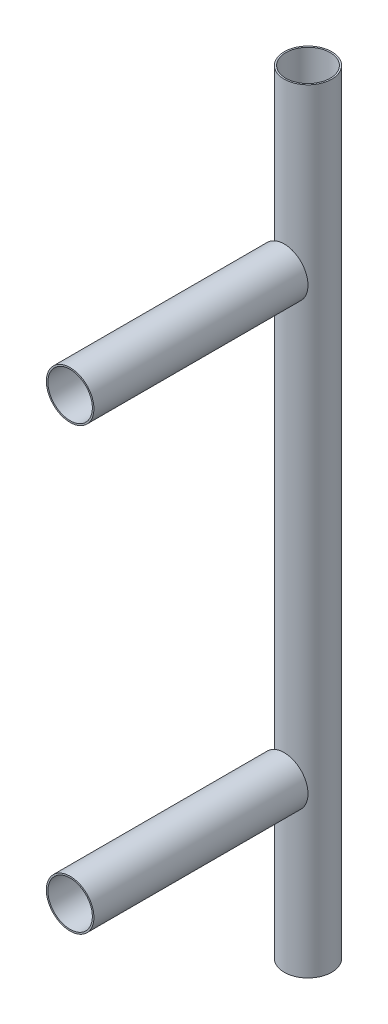
ISO-10303-21;
HEADER;
FILE_DESCRIPTION(('STEP AP214'),'2;1');
FILE_NAME('part.step','',(''),(''),'','','');
FILE_SCHEMA(('AUTOMOTIVE_DESIGN { 1 0 10303 214 1 1 1 1 }'));
ENDSEC;
DATA;
#1=APPLICATION_CONTEXT('core data for automotive mechanical design processes');
#2=APPLICATION_PROTOCOL_DEFINITION('international standard','automotive_design',2000,#1);
#3=PRODUCT_CONTEXT('',#1,'mechanical');
#4=PRODUCT('Part','Part','',(#3));
#5=PRODUCT_RELATED_PRODUCT_CATEGORY('part','',(#4));
#6=PRODUCT_DEFINITION_FORMATION('','',#4);
#7=PRODUCT_DEFINITION_CONTEXT('part definition',#1,'design');
#8=PRODUCT_DEFINITION('design','',#6,#7);
#9=PRODUCT_DEFINITION_SHAPE('','',#8);
#10=(LENGTH_UNIT() NAMED_UNIT(*) SI_UNIT(.MILLI.,.METRE.));
#11=(NAMED_UNIT(*) PLANE_ANGLE_UNIT() SI_UNIT($,.RADIAN.));
#12=(NAMED_UNIT(*) SI_UNIT($,.STERADIAN.) SOLID_ANGLE_UNIT());
#13=UNCERTAINTY_MEASURE_WITH_UNIT(LENGTH_MEASURE(1.E-05),#10,'distance_accuracy_value','');
#14=(GEOMETRIC_REPRESENTATION_CONTEXT(3) GLOBAL_UNCERTAINTY_ASSIGNED_CONTEXT((#13)) GLOBAL_UNIT_ASSIGNED_CONTEXT((#10,
#11,#12)) REPRESENTATION_CONTEXT('',''));
#15=CARTESIAN_POINT('',(0.,0.,0.));
#16=DIRECTION('',(0.,0.,1.));
#17=DIRECTION('',(1.,0.,0.));
#18=AXIS2_PLACEMENT_3D('',#15,#16,#17);
#19=CARTESIAN_POINT('',(0.,88.9,127.));
#20=DIRECTION('',(0.,0.,1.));
#21=DIRECTION('',(1.,0.,0.));
#22=AXIS2_PLACEMENT_3D('',#19,#20,#21);
#23=PLANE('',#22);
#24=CARTESIAN_POINT('',(0.,88.9,127.));
#25=DIRECTION('',(0.,0.,1.));
#26=DIRECTION('',(1.,0.,0.));
#27=AXIS2_PLACEMENT_3D('',#24,#25,#26);
#28=CIRCLE('',#27,12.7);
#29=CARTESIAN_POINT('',(12.7,88.9,127.));
#30=VERTEX_POINT('',#29);
#31=EDGE_CURVE('E11',#30,#30,#28,.T.);
#32=ORIENTED_EDGE('',*,*,#31,.T.);
#33=EDGE_LOOP('',(#32));
#34=FACE_BOUND('',#33,.T.);
#35=CARTESIAN_POINT('',(0.,88.9,127.));
#36=DIRECTION('',(0.,0.,1.));
#37=DIRECTION('',(1.,0.,0.));
#38=AXIS2_PLACEMENT_3D('',#35,#36,#37);
#39=CIRCLE('',#38,11.8745);
#40=CARTESIAN_POINT('',(11.8745,88.9,127.));
#41=VERTEX_POINT('',#40);
#42=EDGE_CURVE('E51',#41,#41,#39,.T.);
#43=ORIENTED_EDGE('',*,*,#42,.F.);
#44=EDGE_LOOP('',(#43));
#45=FACE_BOUND('',#44,.T.);
#46=ADVANCED_FACE('F40',(#34,#45),#23,.T.);
#47=CARTESIAN_POINT('',(0.,88.9,12.7));
#48=DIRECTION('',(0.,0.,1.));
#49=DIRECTION('',(1.,0.,0.));
#50=AXIS2_PLACEMENT_3D('',#47,#48,#49);
#51=PLANE('',#50);
#52=CARTESIAN_POINT('',(0.,88.9,12.7));
#53=DIRECTION('',(0.,0.,1.));
#54=DIRECTION('',(1.,0.,0.));
#55=AXIS2_PLACEMENT_3D('',#52,#53,#54);
#56=CIRCLE('',#55,12.7);
#57=CARTESIAN_POINT('',(12.7,88.9,12.7));
#58=VERTEX_POINT('',#57);
#59=EDGE_CURVE('E44',#58,#58,#56,.T.);
#60=ORIENTED_EDGE('',*,*,#59,.F.);
#61=EDGE_LOOP('',(#60));
#62=FACE_BOUND('',#61,.T.);
#63=CARTESIAN_POINT('',(0.,88.9,12.7));
#64=DIRECTION('',(0.,0.,1.));
#65=DIRECTION('',(1.,0.,0.));
#66=AXIS2_PLACEMENT_3D('',#63,#64,#65);
#67=CIRCLE('',#66,11.8745);
#68=CARTESIAN_POINT('',(11.8745,88.9,12.7));
#69=VERTEX_POINT('',#68);
#70=EDGE_CURVE('E53',#69,#69,#67,.T.);
#71=ORIENTED_EDGE('',*,*,#70,.T.);
#72=EDGE_LOOP('',(#71));
#73=FACE_BOUND('',#72,.T.);
#74=ADVANCED_FACE('F63',(#62,#73),#51,.F.);
#75=CARTESIAN_POINT('',(0.,88.9,127.));
#76=DIRECTION('',(0.,0.,-1.));
#77=DIRECTION('',(-1.,0.,0.));
#78=AXIS2_PLACEMENT_3D('',#75,#76,#77);
#79=CYLINDRICAL_SURFACE('',#78,12.7);
#80=ORIENTED_EDGE('',*,*,#31,.F.);
#81=EDGE_LOOP('',(#80));
#82=FACE_BOUND('',#81,.T.);
#83=ORIENTED_EDGE('',*,*,#59,.T.);
#84=EDGE_LOOP('',(#83));
#85=FACE_BOUND('',#84,.T.);
#86=ADVANCED_FACE('F42',(#82,#85),#79,.T.);
#87=CARTESIAN_POINT('',(0.,88.9,127.));
#88=DIRECTION('',(0.,0.,-1.));
#89=DIRECTION('',(-1.,0.,0.));
#90=AXIS2_PLACEMENT_3D('',#87,#88,#89);
#91=CYLINDRICAL_SURFACE('',#90,11.8745);
#92=ORIENTED_EDGE('',*,*,#42,.T.);
#93=EDGE_LOOP('',(#92));
#94=FACE_BOUND('',#93,.T.);
#95=ORIENTED_EDGE('',*,*,#70,.F.);
#96=EDGE_LOOP('',(#95));
#97=FACE_BOUND('',#96,.T.);
#98=ADVANCED_FACE('F59',(#94,#97),#91,.F.);
#99=CLOSED_SHELL('',(#46,#74,#86,#98));
#100=MANIFOLD_SOLID_BREP('B2',#99);
#101=CARTESIAN_POINT('',(0.,324.104,127.));
#102=DIRECTION('',(0.,0.,1.));
#103=DIRECTION('',(1.,0.,0.));
#104=AXIS2_PLACEMENT_3D('',#101,#102,#103);
#105=PLANE('',#104);
#106=CARTESIAN_POINT('',(0.,324.104,127.));
#107=DIRECTION('',(0.,0.,1.));
#108=DIRECTION('',(1.,0.,0.));
#109=AXIS2_PLACEMENT_3D('',#106,#107,#108);
#110=CIRCLE('',#109,12.7);
#111=CARTESIAN_POINT('',(12.7,324.104,127.));
#112=VERTEX_POINT('',#111);
#113=EDGE_CURVE('E39',#112,#112,#110,.T.);
#114=ORIENTED_EDGE('',*,*,#113,.T.);
#115=EDGE_LOOP('',(#114));
#116=FACE_BOUND('',#115,.T.);
#117=CARTESIAN_POINT('',(0.,324.104,127.));
#118=DIRECTION('',(0.,0.,1.));
#119=DIRECTION('',(1.,0.,0.));
#120=AXIS2_PLACEMENT_3D('',#117,#118,#119);
#121=CIRCLE('',#120,11.8745);
#122=CARTESIAN_POINT('',(11.8745,324.104,127.));
#123=VERTEX_POINT('',#122);
#124=EDGE_CURVE('E120',#123,#123,#121,.T.);
#125=ORIENTED_EDGE('',*,*,#124,.F.);
#126=EDGE_LOOP('',(#125));
#127=FACE_BOUND('',#126,.T.);
#128=ADVANCED_FACE('F109',(#116,#127),#105,.T.);
#129=CARTESIAN_POINT('',(0.,324.104,12.7));
#130=DIRECTION('',(0.,0.,1.));
#131=DIRECTION('',(1.,0.,0.));
#132=AXIS2_PLACEMENT_3D('',#129,#130,#131);
#133=PLANE('',#132);
#134=CARTESIAN_POINT('',(0.,324.104,12.7));
#135=DIRECTION('',(0.,0.,1.));
#136=DIRECTION('',(1.,0.,0.));
#137=AXIS2_PLACEMENT_3D('',#134,#135,#136);
#138=CIRCLE('',#137,12.7);
#139=CARTESIAN_POINT('',(12.7,324.104,12.7));
#140=VERTEX_POINT('',#139);
#141=EDGE_CURVE('E113',#140,#140,#138,.T.);
#142=ORIENTED_EDGE('',*,*,#141,.F.);
#143=EDGE_LOOP('',(#142));
#144=FACE_BOUND('',#143,.T.);
#145=CARTESIAN_POINT('',(0.,324.104,12.7));
#146=DIRECTION('',(0.,0.,1.));
#147=DIRECTION('',(1.,0.,0.));
#148=AXIS2_PLACEMENT_3D('',#145,#146,#147);
#149=CIRCLE('',#148,11.8745);
#150=CARTESIAN_POINT('',(11.8745,324.104,12.7));
#151=VERTEX_POINT('',#150);
#152=EDGE_CURVE('E122',#151,#151,#149,.T.);
#153=ORIENTED_EDGE('',*,*,#152,.T.);
#154=EDGE_LOOP('',(#153));
#155=FACE_BOUND('',#154,.T.);
#156=ADVANCED_FACE('F132',(#144,#155),#133,.F.);
#157=CARTESIAN_POINT('',(0.,324.104,127.));
#158=DIRECTION('',(0.,0.,-1.));
#159=DIRECTION('',(-1.,0.,0.));
#160=AXIS2_PLACEMENT_3D('',#157,#158,#159);
#161=CYLINDRICAL_SURFACE('',#160,12.7);
#162=ORIENTED_EDGE('',*,*,#113,.F.);
#163=EDGE_LOOP('',(#162));
#164=FACE_BOUND('',#163,.T.);
#165=ORIENTED_EDGE('',*,*,#141,.T.);
#166=EDGE_LOOP('',(#165));
#167=FACE_BOUND('',#166,.T.);
#168=ADVANCED_FACE('F111',(#164,#167),#161,.T.);
#169=CARTESIAN_POINT('',(0.,324.104,127.));
#170=DIRECTION('',(0.,0.,-1.));
#171=DIRECTION('',(-1.,0.,0.));
#172=AXIS2_PLACEMENT_3D('',#169,#170,#171);
#173=CYLINDRICAL_SURFACE('',#172,11.8745);
#174=ORIENTED_EDGE('',*,*,#124,.T.);
#175=EDGE_LOOP('',(#174));
#176=FACE_BOUND('',#175,.T.);
#177=ORIENTED_EDGE('',*,*,#152,.F.);
#178=EDGE_LOOP('',(#177));
#179=FACE_BOUND('',#178,.T.);
#180=ADVANCED_FACE('F128',(#176,#179),#173,.F.);
#181=CLOSED_SHELL('',(#128,#156,#168,#180));
#182=MANIFOLD_SOLID_BREP('B6',#181);
#183=CARTESIAN_POINT('',(0.,413.004,0.));
#184=DIRECTION('',(0.,1.,0.));
#185=DIRECTION('',(0.,0.,1.));
#186=AXIS2_PLACEMENT_3D('',#183,#184,#185);
#187=PLANE('',#186);
#188=CARTESIAN_POINT('',(0.,413.004,0.));
#189=DIRECTION('',(0.,1.,0.));
#190=DIRECTION('',(0.,0.,1.));
#191=AXIS2_PLACEMENT_3D('',#188,#189,#190);
#192=CIRCLE('',#191,12.7);
#193=CARTESIAN_POINT('',(0.,413.004,12.7));
#194=VERTEX_POINT('',#193);
#195=EDGE_CURVE('E108',#194,#194,#192,.T.);
#196=ORIENTED_EDGE('',*,*,#195,.T.);
#197=EDGE_LOOP('',(#196));
#198=FACE_BOUND('',#197,.T.);
#199=CARTESIAN_POINT('',(0.,413.004,0.));
#200=DIRECTION('',(0.,1.,0.));
#201=DIRECTION('',(0.,0.,1.));
#202=AXIS2_PLACEMENT_3D('',#199,#200,#201);
#203=CIRCLE('',#202,11.8745);
#204=CARTESIAN_POINT('',(0.,413.004,11.8745));
#205=VERTEX_POINT('',#204);
#206=EDGE_CURVE('E182',#205,#205,#203,.T.);
#207=ORIENTED_EDGE('',*,*,#206,.F.);
#208=EDGE_LOOP('',(#207));
#209=FACE_BOUND('',#208,.T.);
#210=ADVANCED_FACE('F171',(#198,#209),#187,.T.);
#211=CARTESIAN_POINT('',(0.,0.,0.));
#212=DIRECTION('',(0.,1.,0.));
#213=DIRECTION('',(0.,0.,1.));
#214=AXIS2_PLACEMENT_3D('',#211,#212,#213);
#215=PLANE('',#214);
#216=CARTESIAN_POINT('',(0.,0.,0.));
#217=DIRECTION('',(0.,1.,0.));
#218=DIRECTION('',(0.,0.,1.));
#219=AXIS2_PLACEMENT_3D('',#216,#217,#218);
#220=CIRCLE('',#219,12.7);
#221=CARTESIAN_POINT('',(0.,0.,12.7));
#222=VERTEX_POINT('',#221);
#223=EDGE_CURVE('E175',#222,#222,#220,.T.);
#224=ORIENTED_EDGE('',*,*,#223,.F.);
#225=EDGE_LOOP('',(#224));
#226=FACE_BOUND('',#225,.T.);
#227=CARTESIAN_POINT('',(0.,0.,0.));
#228=DIRECTION('',(0.,1.,0.));
#229=DIRECTION('',(0.,0.,1.));
#230=AXIS2_PLACEMENT_3D('',#227,#228,#229);
#231=CIRCLE('',#230,11.8745);
#232=CARTESIAN_POINT('',(0.,0.,11.8745));
#233=VERTEX_POINT('',#232);
#234=EDGE_CURVE('E184',#233,#233,#231,.T.);
#235=ORIENTED_EDGE('',*,*,#234,.T.);
#236=EDGE_LOOP('',(#235));
#237=FACE_BOUND('',#236,.T.);
#238=ADVANCED_FACE('F194',(#226,#237),#215,.F.);
#239=CARTESIAN_POINT('',(0.,413.004,0.));
#240=DIRECTION('',(0.,-1.,0.));
#241=DIRECTION('',(0.,0.,-1.));
#242=AXIS2_PLACEMENT_3D('',#239,#240,#241);
#243=CYLINDRICAL_SURFACE('',#242,12.7);
#244=ORIENTED_EDGE('',*,*,#195,.F.);
#245=EDGE_LOOP('',(#244));
#246=FACE_BOUND('',#245,.T.);
#247=ORIENTED_EDGE('',*,*,#223,.T.);
#248=EDGE_LOOP('',(#247));
#249=FACE_BOUND('',#248,.T.);
#250=ADVANCED_FACE('F173',(#246,#249),#243,.T.);
#251=CARTESIAN_POINT('',(0.,413.004,0.));
#252=DIRECTION('',(0.,-1.,0.));
#253=DIRECTION('',(0.,0.,-1.));
#254=AXIS2_PLACEMENT_3D('',#251,#252,#253);
#255=CYLINDRICAL_SURFACE('',#254,11.8745);
#256=ORIENTED_EDGE('',*,*,#206,.T.);
#257=EDGE_LOOP('',(#256));
#258=FACE_BOUND('',#257,.T.);
#259=ORIENTED_EDGE('',*,*,#234,.F.);
#260=EDGE_LOOP('',(#259));
#261=FACE_BOUND('',#260,.T.);
#262=ADVANCED_FACE('F190',(#258,#261),#255,.F.);
#263=CLOSED_SHELL('',(#210,#238,#250,#262));
#264=MANIFOLD_SOLID_BREP('B34',#263);
#265=ADVANCED_BREP_SHAPE_REPRESENTATION('',(#18,#100,#182,#264),#14);
#266=SHAPE_DEFINITION_REPRESENTATION(#9,#265);
ENDSEC;
END-ISO-10303-21;
